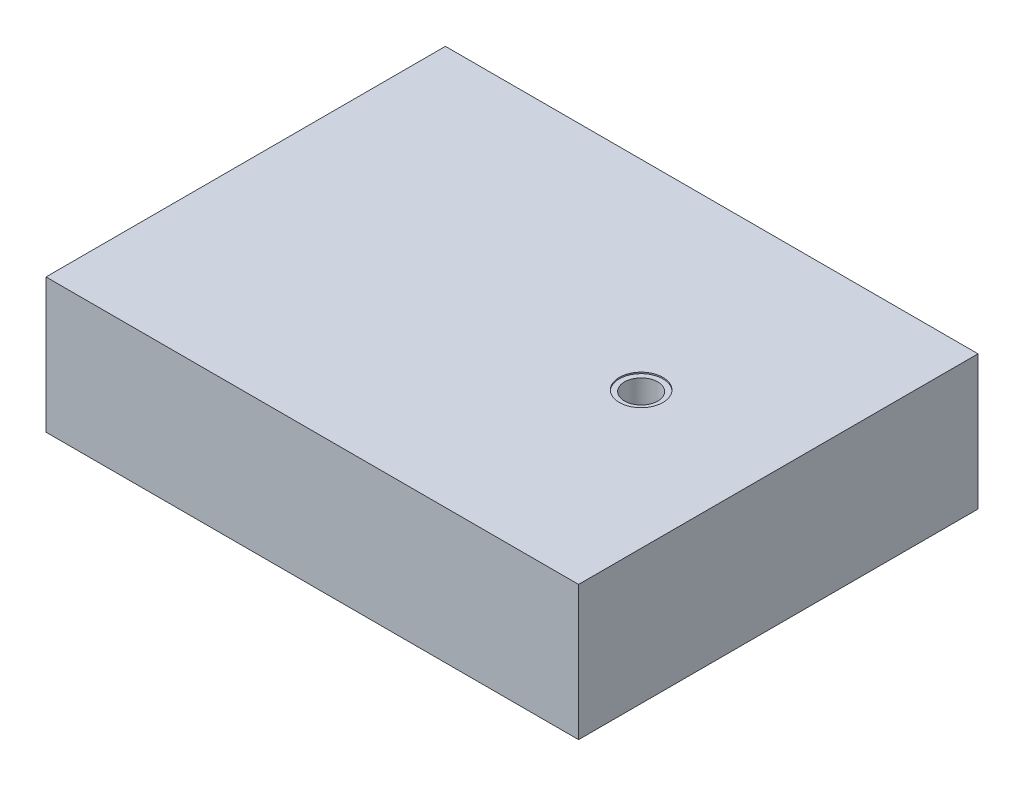
ISO-10303-21;
HEADER;
FILE_DESCRIPTION(('STEP AP214'),'2;1');
FILE_NAME('part.step','',(''),(''),'','','');
FILE_SCHEMA(('AUTOMOTIVE_DESIGN { 1 0 10303 214 1 1 1 1 }'));
ENDSEC;
DATA;
#1=APPLICATION_CONTEXT('core data for automotive mechanical design processes');
#2=APPLICATION_PROTOCOL_DEFINITION('international standard','automotive_design',2000,#1);
#3=PRODUCT_CONTEXT('',#1,'mechanical');
#4=PRODUCT('Part','Part','',(#3));
#5=PRODUCT_RELATED_PRODUCT_CATEGORY('part','',(#4));
#6=PRODUCT_DEFINITION_FORMATION('','',#4);
#7=PRODUCT_DEFINITION_CONTEXT('part definition',#1,'design');
#8=PRODUCT_DEFINITION('design','',#6,#7);
#9=PRODUCT_DEFINITION_SHAPE('','',#8);
#10=(LENGTH_UNIT() NAMED_UNIT(*) SI_UNIT(.MILLI.,.METRE.));
#11=(NAMED_UNIT(*) PLANE_ANGLE_UNIT() SI_UNIT($,.RADIAN.));
#12=(NAMED_UNIT(*) SI_UNIT($,.STERADIAN.) SOLID_ANGLE_UNIT());
#13=UNCERTAINTY_MEASURE_WITH_UNIT(LENGTH_MEASURE(1.E-05),#10,'distance_accuracy_value','');
#14=(GEOMETRIC_REPRESENTATION_CONTEXT(3) GLOBAL_UNCERTAINTY_ASSIGNED_CONTEXT((#13)) GLOBAL_UNIT_ASSIGNED_CONTEXT((#10,
#11,#12)) REPRESENTATION_CONTEXT('',''));
#15=CARTESIAN_POINT('',(0.,0.,0.));
#16=DIRECTION('',(0.,0.,1.));
#17=DIRECTION('',(1.,0.,0.));
#18=AXIS2_PLACEMENT_3D('',#15,#16,#17);
#19=CARTESIAN_POINT('',(0.,1.,0.));
#20=DIRECTION('',(0.,-1.,0.));
#21=DIRECTION('',(0.,0.,-1.));
#22=AXIS2_PLACEMENT_3D('',#19,#20,#21);
#23=PLANE('',#22);
#24=CARTESIAN_POINT('',(2.97,1.,-1.5));
#25=DIRECTION('',(0.,1.,0.));
#26=DIRECTION('',(0.,0.,1.));
#27=AXIS2_PLACEMENT_3D('',#24,#25,#26);
#28=CIRCLE('',#27,0.125);
#29=CARTESIAN_POINT('',(2.97,1.,-1.375));
#30=VERTEX_POINT('',#29);
#31=EDGE_CURVE('E105',#30,#30,#28,.T.);
#32=ORIENTED_EDGE('',*,*,#31,.F.);
#33=EDGE_LOOP('',(#32));
#34=FACE_BOUND('',#33,.T.);
#35=CARTESIAN_POINT('',(2.97,1.,-1.5));
#36=DIRECTION('',(0.,1.,0.));
#37=DIRECTION('',(0.,0.,1.));
#38=AXIS2_PLACEMENT_3D('',#35,#36,#37);
#39=CIRCLE('',#38,0.163722277463716);
#40=CARTESIAN_POINT('',(2.97,1.,-1.33627772253628));
#41=VERTEX_POINT('',#40);
#42=EDGE_CURVE('E99',#41,#41,#39,.T.);
#43=ORIENTED_EDGE('',*,*,#42,.T.);
#44=EDGE_LOOP('',(#43));
#45=FACE_BOUND('',#44,.T.);
#46=ADVANCED_FACE('F35',(#34,#45),#23,.F.);
#47=CARTESIAN_POINT('',(2.97,0.8,-1.5));
#48=DIRECTION('',(0.,1.,0.));
#49=DIRECTION('',(0.,0.,1.));
#50=AXIS2_PLACEMENT_3D('',#47,#48,#49);
#51=CYLINDRICAL_SURFACE('',#50,0.125);
#52=CARTESIAN_POINT('',(2.97,0.8,-1.5));
#53=DIRECTION('',(0.,1.,0.));
#54=DIRECTION('',(0.,0.,1.));
#55=AXIS2_PLACEMENT_3D('',#52,#53,#54);
#56=CIRCLE('',#55,0.125);
#57=CARTESIAN_POINT('',(2.97,0.8,-1.375));
#58=VERTEX_POINT('',#57);
#59=EDGE_CURVE('E106',#58,#58,#56,.T.);
#60=ORIENTED_EDGE('',*,*,#59,.F.);
#61=EDGE_LOOP('',(#60));
#62=FACE_BOUND('',#61,.T.);
#63=ORIENTED_EDGE('',*,*,#31,.T.);
#64=EDGE_LOOP('',(#63));
#65=FACE_BOUND('',#64,.T.);
#66=ADVANCED_FACE('F135',(#62,#65),#51,.F.);
#67=CARTESIAN_POINT('',(2.97,0.8,-1.5));
#68=DIRECTION('',(0.,1.,0.));
#69=DIRECTION('',(0.,0.,1.));
#70=AXIS2_PLACEMENT_3D('',#67,#68,#69);
#71=PLANE('',#70);
#72=ORIENTED_EDGE('',*,*,#59,.T.);
#73=EDGE_LOOP('',(#72));
#74=FACE_BOUND('',#73,.T.);
#75=ADVANCED_FACE('F140',(#74),#71,.T.);
#76=CARTESIAN_POINT('',(0.,1.01,0.));
#77=DIRECTION('',(0.,1.,0.));
#78=DIRECTION('',(0.,0.,1.));
#79=AXIS2_PLACEMENT_3D('',#76,#77,#78);
#80=PLANE('',#79);
#81=DIRECTION('',(0.,0.,1.));
#82=VECTOR('',#81,1.);
#83=CARTESIAN_POINT('',(0.,1.01,-3.));
#84=LINE('',#83,#82);
#85=CARTESIAN_POINT('',(0.,1.01,-3.));
#86=VERTEX_POINT('',#85);
#87=CARTESIAN_POINT('',(0.,1.01,0.));
#88=VERTEX_POINT('',#87);
#89=EDGE_CURVE('E79',#86,#88,#84,.T.);
#90=ORIENTED_EDGE('',*,*,#89,.T.);
#91=DIRECTION('',(1.,0.,0.));
#92=VECTOR('',#91,1.);
#93=CARTESIAN_POINT('',(0.,1.01,0.));
#94=LINE('',#93,#92);
#95=CARTESIAN_POINT('',(4.,1.01,0.));
#96=VERTEX_POINT('',#95);
#97=EDGE_CURVE('E84',#88,#96,#94,.T.);
#98=ORIENTED_EDGE('',*,*,#97,.T.);
#99=DIRECTION('',(0.,0.,-1.));
#100=VECTOR('',#99,1.);
#101=CARTESIAN_POINT('',(4.,1.01,-3.));
#102=LINE('',#101,#100);
#103=CARTESIAN_POINT('',(4.,1.01,-3.));
#104=VERTEX_POINT('',#103);
#105=EDGE_CURVE('E89',#96,#104,#102,.T.);
#106=ORIENTED_EDGE('',*,*,#105,.T.);
#107=DIRECTION('',(-1.,0.,0.));
#108=VECTOR('',#107,1.);
#109=CARTESIAN_POINT('',(0.,1.01,-3.));
#110=LINE('',#109,#108);
#111=EDGE_CURVE('E95',#104,#86,#110,.T.);
#112=ORIENTED_EDGE('',*,*,#111,.T.);
#113=EDGE_LOOP('',(#90,#98,#106,#112));
#114=FACE_BOUND('',#113,.T.);
#115=CARTESIAN_POINT('',(2.97,1.01,-1.5));
#116=DIRECTION('',(0.,1.,0.));
#117=DIRECTION('',(0.,0.,1.));
#118=AXIS2_PLACEMENT_3D('',#115,#116,#117);
#119=CIRCLE('',#118,0.163722277463716);
#120=CARTESIAN_POINT('',(2.97,1.01,-1.33627772253628));
#121=VERTEX_POINT('',#120);
#122=EDGE_CURVE('E96',#121,#121,#119,.T.);
#123=ORIENTED_EDGE('',*,*,#122,.F.);
#124=EDGE_LOOP('',(#123));
#125=FACE_BOUND('',#124,.T.);
#126=ADVANCED_FACE('F92',(#114,#125),#80,.T.);
#127=CARTESIAN_POINT('',(2.97,1.01,-1.5));
#128=DIRECTION('',(0.,-1.,0.));
#129=DIRECTION('',(0.,0.,-1.));
#130=AXIS2_PLACEMENT_3D('',#127,#128,#129);
#131=CYLINDRICAL_SURFACE('',#130,0.163722277463716);
#132=ORIENTED_EDGE('',*,*,#122,.T.);
#133=EDGE_LOOP('',(#132));
#134=FACE_BOUND('',#133,.T.);
#135=ORIENTED_EDGE('',*,*,#42,.F.);
#136=EDGE_LOOP('',(#135));
#137=FACE_BOUND('',#136,.T.);
#138=ADVANCED_FACE('F124',(#134,#137),#131,.F.);
#139=CARTESIAN_POINT('',(0.,0.,0.));
#140=DIRECTION('',(0.,-1.,0.));
#141=DIRECTION('',(0.,0.,-1.));
#142=AXIS2_PLACEMENT_3D('',#139,#140,#141);
#143=PLANE('',#142);
#144=DIRECTION('',(0.,0.,1.));
#145=VECTOR('',#144,1.);
#146=CARTESIAN_POINT('',(0.,0.,0.));
#147=LINE('',#146,#145);
#148=CARTESIAN_POINT('',(0.,0.,-3.));
#149=VERTEX_POINT('',#148);
#150=CARTESIAN_POINT('',(0.,0.,0.));
#151=VERTEX_POINT('',#150);
#152=EDGE_CURVE('E81',#149,#151,#147,.T.);
#153=ORIENTED_EDGE('',*,*,#152,.F.);
#154=DIRECTION('',(-1.,0.,0.));
#155=VECTOR('',#154,1.);
#156=CARTESIAN_POINT('',(0.,0.,-3.));
#157=LINE('',#156,#155);
#158=CARTESIAN_POINT('',(4.,0.,-3.));
#159=VERTEX_POINT('',#158);
#160=EDGE_CURVE('E50',#159,#149,#157,.T.);
#161=ORIENTED_EDGE('',*,*,#160,.F.);
#162=DIRECTION('',(0.,0.,-1.));
#163=VECTOR('',#162,1.);
#164=CARTESIAN_POINT('',(4.,0.,0.));
#165=LINE('',#164,#163);
#166=CARTESIAN_POINT('',(4.,0.,0.));
#167=VERTEX_POINT('',#166);
#168=EDGE_CURVE('E58',#167,#159,#165,.T.);
#169=ORIENTED_EDGE('',*,*,#168,.F.);
#170=DIRECTION('',(1.,0.,0.));
#171=VECTOR('',#170,1.);
#172=CARTESIAN_POINT('',(0.,0.,0.));
#173=LINE('',#172,#171);
#174=EDGE_CURVE('E112',#151,#167,#173,.T.);
#175=ORIENTED_EDGE('',*,*,#174,.F.);
#176=EDGE_LOOP('',(#153,#161,#169,#175));
#177=FACE_BOUND('',#176,.T.);
#178=ADVANCED_FACE('F121',(#177),#143,.T.);
#179=CARTESIAN_POINT('',(0.,1.,-3.));
#180=DIRECTION('',(0.,0.,1.));
#181=DIRECTION('',(1.,0.,0.));
#182=AXIS2_PLACEMENT_3D('',#179,#180,#181);
#183=PLANE('',#182);
#184=ORIENTED_EDGE('',*,*,#160,.T.);
#185=DIRECTION('',(0.,-1.,0.));
#186=VECTOR('',#185,1.);
#187=CARTESIAN_POINT('',(0.,1.,-3.));
#188=LINE('',#187,#186);
#189=EDGE_CURVE('E116',#86,#149,#188,.T.);
#190=ORIENTED_EDGE('',*,*,#189,.F.);
#191=ORIENTED_EDGE('',*,*,#111,.F.);
#192=DIRECTION('',(0.,-1.,0.));
#193=VECTOR('',#192,1.);
#194=CARTESIAN_POINT('',(4.,1.,-3.));
#195=LINE('',#194,#193);
#196=EDGE_CURVE('E118',#104,#159,#195,.T.);
#197=ORIENTED_EDGE('',*,*,#196,.T.);
#198=EDGE_LOOP('',(#184,#190,#191,#197));
#199=FACE_BOUND('',#198,.T.);
#200=ADVANCED_FACE('F123',(#199),#183,.F.);
#201=CARTESIAN_POINT('',(4.,1.,0.));
#202=DIRECTION('',(-1.,0.,0.));
#203=DIRECTION('',(0.,0.,1.));
#204=AXIS2_PLACEMENT_3D('',#201,#202,#203);
#205=PLANE('',#204);
#206=ORIENTED_EDGE('',*,*,#168,.T.);
#207=ORIENTED_EDGE('',*,*,#196,.F.);
#208=ORIENTED_EDGE('',*,*,#105,.F.);
#209=DIRECTION('',(0.,-1.,0.));
#210=VECTOR('',#209,1.);
#211=CARTESIAN_POINT('',(4.,1.,0.));
#212=LINE('',#211,#210);
#213=EDGE_CURVE('E43',#96,#167,#212,.T.);
#214=ORIENTED_EDGE('',*,*,#213,.T.);
#215=EDGE_LOOP('',(#206,#207,#208,#214));
#216=FACE_BOUND('',#215,.T.);
#217=ADVANCED_FACE('F119',(#216),#205,.F.);
#218=CARTESIAN_POINT('',(0.,1.,0.));
#219=DIRECTION('',(0.,0.,-1.));
#220=DIRECTION('',(-1.,0.,0.));
#221=AXIS2_PLACEMENT_3D('',#218,#219,#220);
#222=PLANE('',#221);
#223=ORIENTED_EDGE('',*,*,#174,.T.);
#224=ORIENTED_EDGE('',*,*,#213,.F.);
#225=ORIENTED_EDGE('',*,*,#97,.F.);
#226=DIRECTION('',(0.,-1.,0.));
#227=VECTOR('',#226,1.);
#228=CARTESIAN_POINT('',(0.,1.,0.));
#229=LINE('',#228,#227);
#230=EDGE_CURVE('E11',#88,#151,#229,.T.);
#231=ORIENTED_EDGE('',*,*,#230,.T.);
#232=EDGE_LOOP('',(#223,#224,#225,#231));
#233=FACE_BOUND('',#232,.T.);
#234=ADVANCED_FACE('F85',(#233),#222,.F.);
#235=CARTESIAN_POINT('',(0.,1.,0.));
#236=DIRECTION('',(1.,0.,0.));
#237=DIRECTION('',(0.,0.,-1.));
#238=AXIS2_PLACEMENT_3D('',#235,#236,#237);
#239=PLANE('',#238);
#240=ORIENTED_EDGE('',*,*,#152,.T.);
#241=ORIENTED_EDGE('',*,*,#230,.F.);
#242=ORIENTED_EDGE('',*,*,#89,.F.);
#243=ORIENTED_EDGE('',*,*,#189,.T.);
#244=EDGE_LOOP('',(#240,#241,#242,#243));
#245=FACE_BOUND('',#244,.T.);
#246=ADVANCED_FACE('F37',(#245),#239,.F.);
#247=CLOSED_SHELL('',(#46,#66,#75,#126,#138,#178,#200,#217,#234,#246));
#248=MANIFOLD_SOLID_BREP('B2',#247);
#249=ADVANCED_BREP_SHAPE_REPRESENTATION('',(#18,#248),#14);
#250=SHAPE_DEFINITION_REPRESENTATION(#9,#249);
ENDSEC;
END-ISO-10303-21;
